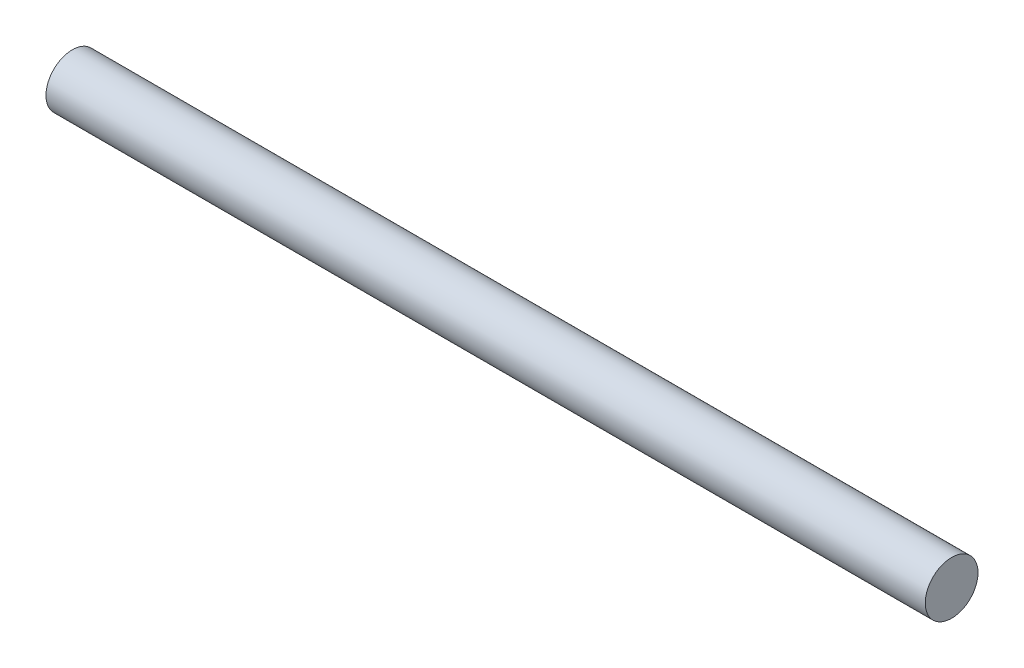
ISO-10303-21;
HEADER;
FILE_DESCRIPTION(('STEP AP214'),'2;1');
FILE_NAME('part.step','',(''),(''),'','','');
FILE_SCHEMA(('AUTOMOTIVE_DESIGN { 1 0 10303 214 1 1 1 1 }'));
ENDSEC;
DATA;
#1=APPLICATION_CONTEXT('core data for automotive mechanical design processes');
#2=APPLICATION_PROTOCOL_DEFINITION('international standard','automotive_design',2000,#1);
#3=PRODUCT_CONTEXT('',#1,'mechanical');
#4=PRODUCT('Part','Part','',(#3));
#5=PRODUCT_RELATED_PRODUCT_CATEGORY('part','',(#4));
#6=PRODUCT_DEFINITION_FORMATION('','',#4);
#7=PRODUCT_DEFINITION_CONTEXT('part definition',#1,'design');
#8=PRODUCT_DEFINITION('design','',#6,#7);
#9=PRODUCT_DEFINITION_SHAPE('','',#8);
#10=(LENGTH_UNIT() NAMED_UNIT(*) SI_UNIT(.MILLI.,.METRE.));
#11=(NAMED_UNIT(*) PLANE_ANGLE_UNIT() SI_UNIT($,.RADIAN.));
#12=(NAMED_UNIT(*) SI_UNIT($,.STERADIAN.) SOLID_ANGLE_UNIT());
#13=UNCERTAINTY_MEASURE_WITH_UNIT(LENGTH_MEASURE(1.E-05),#10,'distance_accuracy_value','');
#14=(GEOMETRIC_REPRESENTATION_CONTEXT(3) GLOBAL_UNCERTAINTY_ASSIGNED_CONTEXT((#13)) GLOBAL_UNIT_ASSIGNED_CONTEXT((#10,
#11,#12)) REPRESENTATION_CONTEXT('',''));
#15=CARTESIAN_POINT('',(0.,0.,0.));
#16=DIRECTION('',(0.,0.,1.));
#17=DIRECTION('',(1.,0.,0.));
#18=AXIS2_PLACEMENT_3D('',#15,#16,#17);
#19=CARTESIAN_POINT('',(1000.,0.,0.));
#20=DIRECTION('',(-1.,0.,0.));
#21=DIRECTION('',(0.,0.,1.));
#22=AXIS2_PLACEMENT_3D('',#19,#20,#21);
#23=CYLINDRICAL_SURFACE('',#22,30.);
#24=CARTESIAN_POINT('',(1000.,0.,0.));
#25=DIRECTION('',(1.,0.,0.));
#26=DIRECTION('',(0.,0.,-1.));
#27=AXIS2_PLACEMENT_3D('',#24,#25,#26);
#28=CIRCLE('',#27,30.);
#29=CARTESIAN_POINT('',(1000.,0.,-30.));
#30=VERTEX_POINT('',#29);
#31=EDGE_CURVE('E10',#30,#30,#28,.T.);
#32=ORIENTED_EDGE('',*,*,#31,.F.);
#33=EDGE_LOOP('',(#32));
#34=FACE_BOUND('',#33,.T.);
#35=CARTESIAN_POINT('',(0.,0.,0.));
#36=DIRECTION('',(1.,0.,0.));
#37=DIRECTION('',(0.,0.,-1.));
#38=AXIS2_PLACEMENT_3D('',#35,#36,#37);
#39=CIRCLE('',#38,30.);
#40=CARTESIAN_POINT('',(0.,0.,-30.));
#41=VERTEX_POINT('',#40);
#42=EDGE_CURVE('E44',#41,#41,#39,.T.);
#43=ORIENTED_EDGE('',*,*,#42,.T.);
#44=EDGE_LOOP('',(#43));
#45=FACE_BOUND('',#44,.T.);
#46=ADVANCED_FACE('F41',(#34,#45),#23,.T.);
#47=CARTESIAN_POINT('',(1000.,0.,0.));
#48=DIRECTION('',(1.,0.,0.));
#49=DIRECTION('',(0.,0.,-1.));
#50=AXIS2_PLACEMENT_3D('',#47,#48,#49);
#51=PLANE('',#50);
#52=ORIENTED_EDGE('',*,*,#31,.T.);
#53=EDGE_LOOP('',(#52));
#54=FACE_BOUND('',#53,.T.);
#55=ADVANCED_FACE('F58',(#54),#51,.T.);
#56=CARTESIAN_POINT('',(0.,0.,0.));
#57=DIRECTION('',(1.,0.,0.));
#58=DIRECTION('',(0.,0.,-1.));
#59=AXIS2_PLACEMENT_3D('',#56,#57,#58);
#60=PLANE('',#59);
#61=ORIENTED_EDGE('',*,*,#42,.F.);
#62=EDGE_LOOP('',(#61));
#63=FACE_BOUND('',#62,.T.);
#64=ADVANCED_FACE('F56',(#63),#60,.F.);
#65=CLOSED_SHELL('',(#46,#55,#64));
#66=MANIFOLD_SOLID_BREP('B2',#65);
#67=ADVANCED_BREP_SHAPE_REPRESENTATION('',(#18,#66),#14);
#68=SHAPE_DEFINITION_REPRESENTATION(#9,#67);
ENDSEC;
END-ISO-10303-21;
